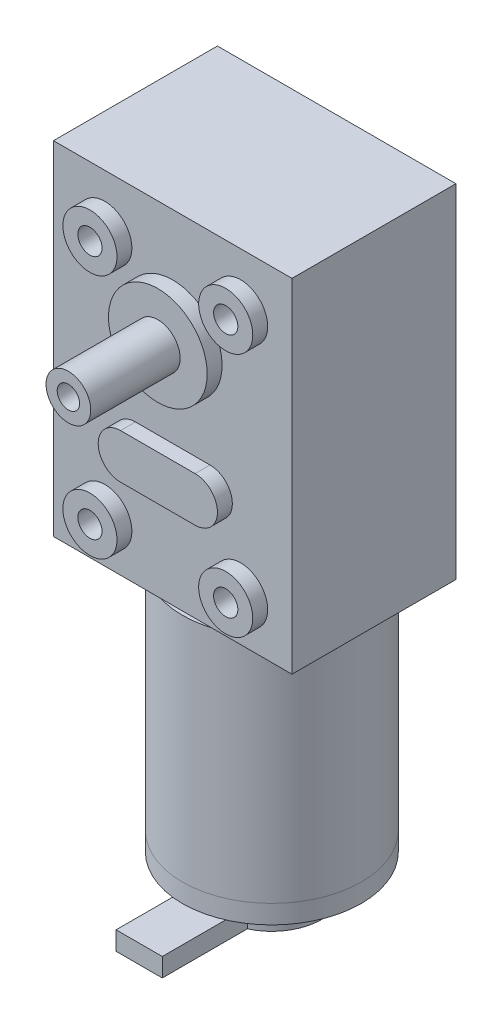
ISO-10303-21;
HEADER;
FILE_DESCRIPTION(('STEP AP214'),'2;1');
FILE_NAME('part.step','',(''),(''),'','','');
FILE_SCHEMA(('AUTOMOTIVE_DESIGN { 1 0 10303 214 1 1 1 1 }'));
ENDSEC;
DATA;
#1=APPLICATION_CONTEXT('core data for automotive mechanical design processes');
#2=APPLICATION_PROTOCOL_DEFINITION('international standard','automotive_design',2000,#1);
#3=PRODUCT_CONTEXT('',#1,'mechanical');
#4=PRODUCT('Part','Part','',(#3));
#5=PRODUCT_RELATED_PRODUCT_CATEGORY('part','',(#4));
#6=PRODUCT_DEFINITION_FORMATION('','',#4);
#7=PRODUCT_DEFINITION_CONTEXT('part definition',#1,'design');
#8=PRODUCT_DEFINITION('design','',#6,#7);
#9=PRODUCT_DEFINITION_SHAPE('','',#8);
#10=(LENGTH_UNIT() NAMED_UNIT(*) SI_UNIT(.MILLI.,.METRE.));
#11=(NAMED_UNIT(*) PLANE_ANGLE_UNIT() SI_UNIT($,.RADIAN.));
#12=(NAMED_UNIT(*) SI_UNIT($,.STERADIAN.) SOLID_ANGLE_UNIT());
#13=UNCERTAINTY_MEASURE_WITH_UNIT(LENGTH_MEASURE(1.E-05),#10,'distance_accuracy_value','');
#14=(GEOMETRIC_REPRESENTATION_CONTEXT(3) GLOBAL_UNCERTAINTY_ASSIGNED_CONTEXT((#13)) GLOBAL_UNIT_ASSIGNED_CONTEXT((#10,
#11,#12)) REPRESENTATION_CONTEXT('',''));
#15=CARTESIAN_POINT('',(0.,0.,0.));
#16=DIRECTION('',(0.,0.,1.));
#17=DIRECTION('',(1.,0.,0.));
#18=AXIS2_PLACEMENT_3D('',#15,#16,#17);
#19=CARTESIAN_POINT('',(0.,-61.,-6.));
#20=DIRECTION('',(0.,-1.,0.));
#21=DIRECTION('',(0.,0.,-1.));
#22=AXIS2_PLACEMENT_3D('',#19,#20,#21);
#23=PLANE('',#22);
#24=DIRECTION('',(0.,0.,1.));
#25=VECTOR('',#24,1.);
#26=CARTESIAN_POINT('',(4.6,-61.,-6.));
#27=LINE('',#26,#25);
#28=CARTESIAN_POINT('',(4.6,-61.,-6.));
#29=VERTEX_POINT('',#28);
#30=CARTESIAN_POINT('',(4.6,-61.,6.));
#31=VERTEX_POINT('',#30);
#32=EDGE_CURVE('E287',#29,#31,#27,.T.);
#33=ORIENTED_EDGE('',*,*,#32,.T.);
#34=DIRECTION('',(1.,0.,0.));
#35=VECTOR('',#34,1.);
#36=CARTESIAN_POINT('',(0.,-61.,6.));
#37=LINE('',#36,#35);
#38=CARTESIAN_POINT('',(-1.6,-61.,6.));
#39=VERTEX_POINT('',#38);
#40=EDGE_CURVE('E324',#39,#31,#37,.T.);
#41=ORIENTED_EDGE('',*,*,#40,.F.);
#42=DIRECTION('',(0.,0.,1.));
#43=VECTOR('',#42,1.);
#44=CARTESIAN_POINT('',(-1.6,-61.,-6.));
#45=LINE('',#44,#43);
#46=CARTESIAN_POINT('',(-1.6,-61.,-6.));
#47=VERTEX_POINT('',#46);
#48=EDGE_CURVE('E13',#47,#39,#45,.T.);
#49=ORIENTED_EDGE('',*,*,#48,.F.);
#50=DIRECTION('',(1.,0.,0.));
#51=VECTOR('',#50,1.);
#52=CARTESIAN_POINT('',(0.,-61.,-6.));
#53=LINE('',#52,#51);
#54=EDGE_CURVE('E326',#47,#29,#53,.T.);
#55=ORIENTED_EDGE('',*,*,#54,.T.);
#56=EDGE_LOOP('',(#33,#41,#49,#55));
#57=FACE_BOUND('',#56,.T.);
#58=ADVANCED_FACE('F284',(#57),#23,.T.);
#59=CARTESIAN_POINT('',(-1.6,0.,-6.));
#60=DIRECTION('',(1.,0.,0.));
#61=DIRECTION('',(0.,0.,-1.));
#62=AXIS2_PLACEMENT_3D('',#59,#60,#61);
#63=PLANE('',#62);
#64=ORIENTED_EDGE('',*,*,#48,.T.);
#65=DIRECTION('',(0.,1.,0.));
#66=VECTOR('',#65,1.);
#67=CARTESIAN_POINT('',(-1.6,0.,6.));
#68=LINE('',#67,#66);
#69=CARTESIAN_POINT('',(-1.6,-58.5,6.));
#70=VERTEX_POINT('',#69);
#71=EDGE_CURVE('E342',#39,#70,#68,.T.);
#72=ORIENTED_EDGE('',*,*,#71,.T.);
#73=DIRECTION('',(0.,0.,1.));
#74=VECTOR('',#73,1.);
#75=CARTESIAN_POINT('',(-1.6,-58.5,-6.));
#76=LINE('',#75,#74);
#77=CARTESIAN_POINT('',(-1.6,-58.5,-6.));
#78=VERTEX_POINT('',#77);
#79=EDGE_CURVE('E292',#78,#70,#76,.T.);
#80=ORIENTED_EDGE('',*,*,#79,.F.);
#81=DIRECTION('',(0.,1.,0.));
#82=VECTOR('',#81,1.);
#83=CARTESIAN_POINT('',(-1.6,0.,-6.));
#84=LINE('',#83,#82);
#85=EDGE_CURVE('E305',#47,#78,#84,.T.);
#86=ORIENTED_EDGE('',*,*,#85,.F.);
#87=EDGE_LOOP('',(#64,#72,#80,#86));
#88=FACE_BOUND('',#87,.T.);
#89=ADVANCED_FACE('F357',(#88),#63,.F.);
#90=CARTESIAN_POINT('',(0.,-58.5,-6.));
#91=DIRECTION('',(0.,-1.,0.));
#92=DIRECTION('',(0.,0.,-1.));
#93=AXIS2_PLACEMENT_3D('',#90,#91,#92);
#94=PLANE('',#93);
#95=ORIENTED_EDGE('',*,*,#79,.T.);
#96=DIRECTION('',(1.,0.,0.));
#97=VECTOR('',#96,1.);
#98=CARTESIAN_POINT('',(0.,-58.5,6.));
#99=LINE('',#98,#97);
#100=CARTESIAN_POINT('',(4.6,-58.5,6.));
#101=VERTEX_POINT('',#100);
#102=EDGE_CURVE('E338',#70,#101,#99,.T.);
#103=ORIENTED_EDGE('',*,*,#102,.T.);
#104=DIRECTION('',(0.,0.,1.));
#105=VECTOR('',#104,1.);
#106=CARTESIAN_POINT('',(4.6,-58.5,-6.));
#107=LINE('',#106,#105);
#108=CARTESIAN_POINT('',(4.6,-58.5,-6.));
#109=VERTEX_POINT('',#108);
#110=EDGE_CURVE('E330',#109,#101,#107,.T.);
#111=ORIENTED_EDGE('',*,*,#110,.F.);
#112=DIRECTION('',(1.,0.,0.));
#113=VECTOR('',#112,1.);
#114=CARTESIAN_POINT('',(0.,-58.5,-6.));
#115=LINE('',#114,#113);
#116=EDGE_CURVE('E350',#78,#109,#115,.T.);
#117=ORIENTED_EDGE('',*,*,#116,.F.);
#118=EDGE_LOOP('',(#95,#103,#111,#117));
#119=FACE_BOUND('',#118,.T.);
#120=ADVANCED_FACE('F355',(#119),#94,.F.);
#121=CARTESIAN_POINT('',(4.6,0.,-6.));
#122=DIRECTION('',(1.,0.,0.));
#123=DIRECTION('',(0.,0.,-1.));
#124=AXIS2_PLACEMENT_3D('',#121,#122,#123);
#125=PLANE('',#124);
#126=ORIENTED_EDGE('',*,*,#110,.T.);
#127=DIRECTION('',(0.,1.,0.));
#128=VECTOR('',#127,1.);
#129=CARTESIAN_POINT('',(4.6,0.,6.));
#130=LINE('',#129,#128);
#131=EDGE_CURVE('E332',#31,#101,#130,.T.);
#132=ORIENTED_EDGE('',*,*,#131,.F.);
#133=ORIENTED_EDGE('',*,*,#32,.F.);
#134=DIRECTION('',(0.,1.,0.));
#135=VECTOR('',#134,1.);
#136=CARTESIAN_POINT('',(4.6,0.,-6.));
#137=LINE('',#136,#135);
#138=EDGE_CURVE('E348',#29,#109,#137,.T.);
#139=ORIENTED_EDGE('',*,*,#138,.T.);
#140=EDGE_LOOP('',(#126,#132,#133,#139));
#141=FACE_BOUND('',#140,.T.);
#142=ADVANCED_FACE('F333',(#141),#125,.T.);
#143=CARTESIAN_POINT('',(0.,0.,-6.));
#144=DIRECTION('',(0.,0.,1.));
#145=DIRECTION('',(1.,0.,0.));
#146=AXIS2_PLACEMENT_3D('',#143,#144,#145);
#147=PLANE('',#146);
#148=ORIENTED_EDGE('',*,*,#54,.F.);
#149=ORIENTED_EDGE('',*,*,#85,.T.);
#150=ORIENTED_EDGE('',*,*,#116,.T.);
#151=ORIENTED_EDGE('',*,*,#138,.F.);
#152=EDGE_LOOP('',(#148,#149,#150,#151));
#153=FACE_BOUND('',#152,.T.);
#154=ADVANCED_FACE('F358',(#153),#147,.F.);
#155=CARTESIAN_POINT('',(0.,0.,6.));
#156=DIRECTION('',(0.,0.,1.));
#157=DIRECTION('',(1.,0.,0.));
#158=AXIS2_PLACEMENT_3D('',#155,#156,#157);
#159=PLANE('',#158);
#160=ORIENTED_EDGE('',*,*,#40,.T.);
#161=ORIENTED_EDGE('',*,*,#131,.T.);
#162=ORIENTED_EDGE('',*,*,#102,.F.);
#163=ORIENTED_EDGE('',*,*,#71,.F.);
#164=EDGE_LOOP('',(#160,#161,#162,#163));
#165=FACE_BOUND('',#164,.T.);
#166=ADVANCED_FACE('F340',(#165),#159,.T.);
#167=CLOSED_SHELL('',(#58,#89,#120,#142,#154,#166));
#168=MANIFOLD_SOLID_BREP('B2',#167);
#169=CARTESIAN_POINT('',(1.8,-61.,-11.5));
#170=DIRECTION('',(0.,1.,0.));
#171=DIRECTION('',(0.,0.,1.));
#172=AXIS2_PLACEMENT_3D('',#169,#170,#171);
#173=CYLINDRICAL_SURFACE('',#172,6.7);
#174=CARTESIAN_POINT('',(1.8,-58.5,-11.5));
#175=DIRECTION('',(0.,-1.,0.));
#176=DIRECTION('',(0.,0.,-1.));
#177=AXIS2_PLACEMENT_3D('',#174,#175,#176);
#178=CIRCLE('',#177,6.7);
#179=CARTESIAN_POINT('',(4.6,-58.5,-5.41312888258672));
#180=VERTEX_POINT('',#179);
#181=CARTESIAN_POINT('',(-1.6,-58.5,-5.72678599045557));
#182=VERTEX_POINT('',#181);
#183=EDGE_CURVE('E282',#180,#182,#178,.T.);
#184=ORIENTED_EDGE('',*,*,#183,.F.);
#185=DIRECTION('',(0.,1.,0.));
#186=VECTOR('',#185,1.);
#187=CARTESIAN_POINT('',(4.6,-61.,-5.41312888258672));
#188=LINE('',#187,#186);
#189=CARTESIAN_POINT('',(4.6,-61.,-5.41312888258672));
#190=VERTEX_POINT('',#189);
#191=EDGE_CURVE('E473',#180,#190,#188,.F.);
#192=ORIENTED_EDGE('',*,*,#191,.T.);
#193=CARTESIAN_POINT('',(1.8,-61.,-11.5));
#194=DIRECTION('',(0.,-1.,0.));
#195=DIRECTION('',(0.,0.,-1.));
#196=AXIS2_PLACEMENT_3D('',#193,#194,#195);
#197=CIRCLE('',#196,6.7);
#198=CARTESIAN_POINT('',(-1.6,-61.,-5.72678599045557));
#199=VERTEX_POINT('',#198);
#200=EDGE_CURVE('E458',#199,#190,#197,.T.);
#201=ORIENTED_EDGE('',*,*,#200,.F.);
#202=DIRECTION('',(0.,1.,0.));
#203=VECTOR('',#202,1.);
#204=CARTESIAN_POINT('',(-1.6,-61.,-5.72678599045557));
#205=LINE('',#204,#203);
#206=EDGE_CURVE('E514',#182,#199,#205,.F.);
#207=ORIENTED_EDGE('',*,*,#206,.F.);
#208=EDGE_LOOP('',(#184,#192,#201,#207));
#209=FACE_BOUND('',#208,.T.);
#210=CARTESIAN_POINT('',(1.8,-56.5,-11.5));
#211=DIRECTION('',(0.,-1.,0.));
#212=DIRECTION('',(0.,0.,-1.));
#213=AXIS2_PLACEMENT_3D('',#210,#211,#212);
#214=CIRCLE('',#213,6.7);
#215=CARTESIAN_POINT('',(1.8,-56.5,-18.2));
#216=VERTEX_POINT('',#215);
#217=EDGE_CURVE('E520',#216,#216,#214,.T.);
#218=ORIENTED_EDGE('',*,*,#217,.T.);
#219=EDGE_LOOP('',(#218));
#220=FACE_BOUND('',#219,.T.);
#221=ADVANCED_FACE('F451',(#209,#220),#173,.T.);
#222=CARTESIAN_POINT('',(1.8,-61.,-11.5));
#223=DIRECTION('',(0.,-1.,0.));
#224=DIRECTION('',(0.,0.,-1.));
#225=AXIS2_PLACEMENT_3D('',#222,#223,#224);
#226=PLANE('',#225);
#227=DIRECTION('',(0.,0.,1.));
#228=VECTOR('',#227,1.);
#229=CARTESIAN_POINT('',(4.6,-61.,-6.));
#230=LINE('',#229,#228);
#231=CARTESIAN_POINT('',(4.6,-61.,-6.));
#232=VERTEX_POINT('',#231);
#233=EDGE_CURVE('E515',#232,#190,#230,.T.);
#234=ORIENTED_EDGE('',*,*,#233,.F.);
#235=DIRECTION('',(1.,0.,0.));
#236=VECTOR('',#235,1.);
#237=CARTESIAN_POINT('',(0.,-61.,-6.));
#238=LINE('',#237,#236);
#239=CARTESIAN_POINT('',(-1.6,-61.,-6.));
#240=VERTEX_POINT('',#239);
#241=EDGE_CURVE('E497',#240,#232,#238,.T.);
#242=ORIENTED_EDGE('',*,*,#241,.F.);
#243=DIRECTION('',(0.,0.,1.));
#244=VECTOR('',#243,1.);
#245=CARTESIAN_POINT('',(-1.6,-61.,-6.));
#246=LINE('',#245,#244);
#247=EDGE_CURVE('E495',#240,#199,#246,.T.);
#248=ORIENTED_EDGE('',*,*,#247,.T.);
#249=ORIENTED_EDGE('',*,*,#200,.T.);
#250=EDGE_LOOP('',(#234,#242,#248,#249));
#251=FACE_BOUND('',#250,.T.);
#252=ADVANCED_FACE('F528',(#251),#226,.T.);
#253=CARTESIAN_POINT('',(1.8,-56.5,-11.5));
#254=DIRECTION('',(0.,-1.,0.));
#255=DIRECTION('',(0.,0.,-1.));
#256=AXIS2_PLACEMENT_3D('',#253,#254,#255);
#257=PLANE('',#256);
#258=ORIENTED_EDGE('',*,*,#217,.F.);
#259=EDGE_LOOP('',(#258));
#260=FACE_BOUND('',#259,.T.);
#261=ADVANCED_FACE('F526',(#260),#257,.F.);
#262=CARTESIAN_POINT('',(0.,-58.5,-6.));
#263=DIRECTION('',(0.,-1.,0.));
#264=DIRECTION('',(0.,0.,-1.));
#265=AXIS2_PLACEMENT_3D('',#262,#263,#264);
#266=PLANE('',#265);
#267=ORIENTED_EDGE('',*,*,#183,.T.);
#268=DIRECTION('',(0.,0.,1.));
#269=VECTOR('',#268,1.);
#270=CARTESIAN_POINT('',(-1.6,-58.5,-6.));
#271=LINE('',#270,#269);
#272=CARTESIAN_POINT('',(-1.6,-58.5,-6.));
#273=VERTEX_POINT('',#272);
#274=EDGE_CURVE('E492',#273,#182,#271,.T.);
#275=ORIENTED_EDGE('',*,*,#274,.F.);
#276=DIRECTION('',(1.,0.,0.));
#277=VECTOR('',#276,1.);
#278=CARTESIAN_POINT('',(0.,-58.5,-6.));
#279=LINE('',#278,#277);
#280=CARTESIAN_POINT('',(4.6,-58.5,-6.));
#281=VERTEX_POINT('',#280);
#282=EDGE_CURVE('E498',#273,#281,#279,.T.);
#283=ORIENTED_EDGE('',*,*,#282,.T.);
#284=DIRECTION('',(0.,0.,1.));
#285=VECTOR('',#284,1.);
#286=CARTESIAN_POINT('',(4.6,-58.5,-6.));
#287=LINE('',#286,#285);
#288=EDGE_CURVE('E512',#281,#180,#287,.T.);
#289=ORIENTED_EDGE('',*,*,#288,.T.);
#290=EDGE_LOOP('',(#267,#275,#283,#289));
#291=FACE_BOUND('',#290,.T.);
#292=ADVANCED_FACE('F501',(#291),#266,.T.);
#293=CARTESIAN_POINT('',(4.6,0.,-6.));
#294=DIRECTION('',(1.,0.,0.));
#295=DIRECTION('',(0.,0.,-1.));
#296=AXIS2_PLACEMENT_3D('',#293,#294,#295);
#297=PLANE('',#296);
#298=ORIENTED_EDGE('',*,*,#288,.F.);
#299=DIRECTION('',(0.,1.,0.));
#300=VECTOR('',#299,1.);
#301=CARTESIAN_POINT('',(4.6,0.,-6.));
#302=LINE('',#301,#300);
#303=EDGE_CURVE('E503',#232,#281,#302,.T.);
#304=ORIENTED_EDGE('',*,*,#303,.F.);
#305=ORIENTED_EDGE('',*,*,#233,.T.);
#306=ORIENTED_EDGE('',*,*,#191,.F.);
#307=EDGE_LOOP('',(#298,#304,#305,#306));
#308=FACE_BOUND('',#307,.T.);
#309=ADVANCED_FACE('F533',(#308),#297,.F.);
#310=CARTESIAN_POINT('',(-1.6,0.,-6.));
#311=DIRECTION('',(1.,0.,0.));
#312=DIRECTION('',(0.,0.,-1.));
#313=AXIS2_PLACEMENT_3D('',#310,#311,#312);
#314=PLANE('',#313);
#315=ORIENTED_EDGE('',*,*,#206,.T.);
#316=ORIENTED_EDGE('',*,*,#247,.F.);
#317=DIRECTION('',(0.,1.,0.));
#318=VECTOR('',#317,1.);
#319=CARTESIAN_POINT('',(-1.6,0.,-6.));
#320=LINE('',#319,#318);
#321=EDGE_CURVE('E465',#240,#273,#320,.T.);
#322=ORIENTED_EDGE('',*,*,#321,.T.);
#323=ORIENTED_EDGE('',*,*,#274,.T.);
#324=EDGE_LOOP('',(#315,#316,#322,#323));
#325=FACE_BOUND('',#324,.T.);
#326=ADVANCED_FACE('F491',(#325),#314,.T.);
#327=CARTESIAN_POINT('',(0.,0.,-6.));
#328=DIRECTION('',(0.,0.,1.));
#329=DIRECTION('',(1.,0.,0.));
#330=AXIS2_PLACEMENT_3D('',#327,#328,#329);
#331=PLANE('',#330);
#332=ORIENTED_EDGE('',*,*,#282,.F.);
#333=ORIENTED_EDGE('',*,*,#321,.F.);
#334=ORIENTED_EDGE('',*,*,#241,.T.);
#335=ORIENTED_EDGE('',*,*,#303,.T.);
#336=EDGE_LOOP('',(#332,#333,#334,#335));
#337=FACE_BOUND('',#336,.T.);
#338=ADVANCED_FACE('F506',(#337),#331,.T.);
#339=CLOSED_SHELL('',(#221,#252,#261,#292,#309,#326,#338));
#340=MANIFOLD_SOLID_BREP('B7',#339);
#341=CARTESIAN_POINT('',(1.8,-56.5,-11.5));
#342=DIRECTION('',(0.,1.,0.));
#343=DIRECTION('',(0.,0.,1.));
#344=AXIS2_PLACEMENT_3D('',#341,#342,#343);
#345=CYLINDRICAL_SURFACE('',#344,12.);
#346=CARTESIAN_POINT('',(1.8,-56.5,-11.5));
#347=DIRECTION('',(0.,-1.,0.));
#348=DIRECTION('',(0.,0.,-1.));
#349=AXIS2_PLACEMENT_3D('',#346,#347,#348);
#350=CIRCLE('',#349,12.);
#351=CARTESIAN_POINT('',(1.8,-56.5,-23.5));
#352=VERTEX_POINT('',#351);
#353=EDGE_CURVE('E450',#352,#352,#350,.T.);
#354=ORIENTED_EDGE('',*,*,#353,.F.);
#355=EDGE_LOOP('',(#354));
#356=FACE_BOUND('',#355,.T.);
#357=CARTESIAN_POINT('',(1.8,-54.,-11.5));
#358=DIRECTION('',(0.,-1.,0.));
#359=DIRECTION('',(0.,0.,-1.));
#360=AXIS2_PLACEMENT_3D('',#357,#358,#359);
#361=CIRCLE('',#360,12.);
#362=CARTESIAN_POINT('',(1.8,-54.,-23.5));
#363=VERTEX_POINT('',#362);
#364=EDGE_CURVE('E626',#363,#363,#361,.T.);
#365=ORIENTED_EDGE('',*,*,#364,.T.);
#366=EDGE_LOOP('',(#365));
#367=FACE_BOUND('',#366,.T.);
#368=ADVANCED_FACE('F623',(#356,#367),#345,.T.);
#369=CARTESIAN_POINT('',(1.8,-56.5,-11.5));
#370=DIRECTION('',(0.,-1.,0.));
#371=DIRECTION('',(0.,0.,-1.));
#372=AXIS2_PLACEMENT_3D('',#369,#370,#371);
#373=PLANE('',#372);
#374=ORIENTED_EDGE('',*,*,#353,.T.);
#375=EDGE_LOOP('',(#374));
#376=FACE_BOUND('',#375,.T.);
#377=ADVANCED_FACE('F638',(#376),#373,.T.);
#378=CARTESIAN_POINT('',(1.8,-54.,-11.5));
#379=DIRECTION('',(0.,-1.,0.));
#380=DIRECTION('',(0.,0.,-1.));
#381=AXIS2_PLACEMENT_3D('',#378,#379,#380);
#382=PLANE('',#381);
#383=ORIENTED_EDGE('',*,*,#364,.F.);
#384=EDGE_LOOP('',(#383));
#385=FACE_BOUND('',#384,.T.);
#386=ADVANCED_FACE('F636',(#385),#382,.F.);
#387=CLOSED_SHELL('',(#368,#377,#386));
#388=MANIFOLD_SOLID_BREP('B276',#387);
#389=CARTESIAN_POINT('',(1.8,-54.,-11.5));
#390=DIRECTION('',(0.,1.,0.));
#391=DIRECTION('',(0.,0.,1.));
#392=AXIS2_PLACEMENT_3D('',#389,#390,#391);
#393=CYLINDRICAL_SURFACE('',#392,12.);
#394=CARTESIAN_POINT('',(1.8,-54.,-11.5));
#395=DIRECTION('',(0.,-1.,0.));
#396=DIRECTION('',(0.,0.,-1.));
#397=AXIS2_PLACEMENT_3D('',#394,#395,#396);
#398=CIRCLE('',#397,12.);
#399=CARTESIAN_POINT('',(1.8,-54.,-23.5));
#400=VERTEX_POINT('',#399);
#401=EDGE_CURVE('E622',#400,#400,#398,.T.);
#402=ORIENTED_EDGE('',*,*,#401,.F.);
#403=EDGE_LOOP('',(#402));
#404=FACE_BOUND('',#403,.T.);
#405=CARTESIAN_POINT('',(1.8,-23.,-11.5));
#406=DIRECTION('',(0.,-1.,0.));
#407=DIRECTION('',(0.,0.,-1.));
#408=AXIS2_PLACEMENT_3D('',#405,#406,#407);
#409=CIRCLE('',#408,12.);
#410=CARTESIAN_POINT('',(1.8,-23.,-23.5));
#411=VERTEX_POINT('',#410);
#412=EDGE_CURVE('E681',#411,#411,#409,.T.);
#413=ORIENTED_EDGE('',*,*,#412,.T.);
#414=EDGE_LOOP('',(#413));
#415=FACE_BOUND('',#414,.T.);
#416=ADVANCED_FACE('F678',(#404,#415),#393,.T.);
#417=CARTESIAN_POINT('',(1.8,-54.,-11.5));
#418=DIRECTION('',(0.,-1.,0.));
#419=DIRECTION('',(0.,0.,-1.));
#420=AXIS2_PLACEMENT_3D('',#417,#418,#419);
#421=PLANE('',#420);
#422=ORIENTED_EDGE('',*,*,#401,.T.);
#423=EDGE_LOOP('',(#422));
#424=FACE_BOUND('',#423,.T.);
#425=ADVANCED_FACE('F693',(#424),#421,.T.);
#426=CARTESIAN_POINT('',(1.8,-23.,-11.5));
#427=DIRECTION('',(0.,-1.,0.));
#428=DIRECTION('',(0.,0.,-1.));
#429=AXIS2_PLACEMENT_3D('',#426,#427,#428);
#430=PLANE('',#429);
#431=ORIENTED_EDGE('',*,*,#412,.F.);
#432=EDGE_LOOP('',(#431));
#433=FACE_BOUND('',#432,.T.);
#434=ADVANCED_FACE('F691',(#433),#430,.F.);
#435=CLOSED_SHELL('',(#416,#425,#434));
#436=MANIFOLD_SOLID_BREP('B445',#435);
#437=CARTESIAN_POINT('',(9.11,15.77,-12.));
#438=DIRECTION('',(0.,0.,1.));
#439=DIRECTION('',(1.,0.,0.));
#440=AXIS2_PLACEMENT_3D('',#437,#438,#439);
#441=CYLINDRICAL_SURFACE('',#440,1.625);
#442=CARTESIAN_POINT('',(9.11,15.77,-12.));
#443=DIRECTION('',(0.,0.,1.));
#444=DIRECTION('',(1.,0.,0.));
#445=AXIS2_PLACEMENT_3D('',#442,#443,#444);
#446=CIRCLE('',#445,1.625);
#447=CARTESIAN_POINT('',(10.735,15.77,-12.));
#448=VERTEX_POINT('',#447);
#449=EDGE_CURVE('E925',#448,#448,#446,.T.);
#450=ORIENTED_EDGE('',*,*,#449,.F.);
#451=EDGE_LOOP('',(#450));
#452=FACE_BOUND('',#451,.T.);
#453=CARTESIAN_POINT('',(9.11,15.77,2.));
#454=DIRECTION('',(0.,0.,1.));
#455=DIRECTION('',(1.,0.,0.));
#456=AXIS2_PLACEMENT_3D('',#453,#454,#455);
#457=CIRCLE('',#456,1.625);
#458=CARTESIAN_POINT('',(10.735,15.77,2.));
#459=VERTEX_POINT('',#458);
#460=EDGE_CURVE('E929',#459,#459,#457,.F.);
#461=ORIENTED_EDGE('',*,*,#460,.F.);
#462=EDGE_LOOP('',(#461));
#463=FACE_BOUND('',#462,.T.);
#464=ADVANCED_FACE('F743',(#452,#463),#441,.F.);
#465=CARTESIAN_POINT('',(9.11,15.77,-12.));
#466=DIRECTION('',(0.,0.,1.));
#467=DIRECTION('',(1.,0.,0.));
#468=AXIS2_PLACEMENT_3D('',#465,#466,#467);
#469=PLANE('',#468);
#470=ORIENTED_EDGE('',*,*,#449,.T.);
#471=EDGE_LOOP('',(#470));
#472=FACE_BOUND('',#471,.T.);
#473=ADVANCED_FACE('F944',(#472),#469,.T.);
#474=CARTESIAN_POINT('',(0.,0.,0.));
#475=DIRECTION('',(0.,0.,1.));
#476=DIRECTION('',(1.,0.,0.));
#477=AXIS2_PLACEMENT_3D('',#474,#475,#476);
#478=PLANE('',#477);
#479=CARTESIAN_POINT('',(0.,8.2,0.));
#480=DIRECTION('',(0.,0.,1.));
#481=DIRECTION('',(1.,0.,0.));
#482=AXIS2_PLACEMENT_3D('',#479,#480,#481);
#483=CIRCLE('',#482,6.62);
#484=CARTESIAN_POINT('',(6.62,8.2,0.));
#485=VERTEX_POINT('',#484);
#486=EDGE_CURVE('E913',#485,#485,#483,.T.);
#487=ORIENTED_EDGE('',*,*,#486,.F.);
#488=EDGE_LOOP('',(#487));
#489=FACE_BOUND('',#488,.T.);
#490=CARTESIAN_POINT('',(-9.11000000000001,-17.13,0.));
#491=DIRECTION('',(0.,0.,1.));
#492=DIRECTION('',(1.,0.,0.));
#493=AXIS2_PLACEMENT_3D('',#490,#491,#492);
#494=CIRCLE('',#493,3.63);
#495=CARTESIAN_POINT('',(-5.48000000000001,-17.13,0.));
#496=VERTEX_POINT('',#495);
#497=EDGE_CURVE('E844',#496,#496,#494,.F.);
#498=ORIENTED_EDGE('',*,*,#497,.T.);
#499=EDGE_LOOP('',(#498));
#500=FACE_BOUND('',#499,.T.);
#501=CARTESIAN_POINT('',(9.11,-17.13,0.));
#502=DIRECTION('',(0.,0.,1.));
#503=DIRECTION('',(1.,0.,0.));
#504=AXIS2_PLACEMENT_3D('',#501,#502,#503);
#505=CIRCLE('',#504,3.63);
#506=CARTESIAN_POINT('',(12.74,-17.13,0.));
#507=VERTEX_POINT('',#506);
#508=EDGE_CURVE('E676',#507,#507,#505,.T.);
#509=ORIENTED_EDGE('',*,*,#508,.F.);
#510=EDGE_LOOP('',(#509));
#511=FACE_BOUND('',#510,.T.);
#512=CARTESIAN_POINT('',(-9.11,15.77,0.));
#513=DIRECTION('',(0.,0.,1.));
#514=DIRECTION('',(1.,0.,0.));
#515=AXIS2_PLACEMENT_3D('',#512,#513,#514);
#516=CIRCLE('',#515,3.63);
#517=CARTESIAN_POINT('',(-5.48,15.77,0.));
#518=VERTEX_POINT('',#517);
#519=EDGE_CURVE('E862',#518,#518,#516,.F.);
#520=ORIENTED_EDGE('',*,*,#519,.T.);
#521=EDGE_LOOP('',(#520));
#522=FACE_BOUND('',#521,.T.);
#523=CARTESIAN_POINT('',(9.11,15.77,0.));
#524=DIRECTION('',(0.,0.,1.));
#525=DIRECTION('',(1.,0.,0.));
#526=AXIS2_PLACEMENT_3D('',#523,#524,#525);
#527=CIRCLE('',#526,3.63);
#528=CARTESIAN_POINT('',(12.74,15.77,0.));
#529=VERTEX_POINT('',#528);
#530=EDGE_CURVE('E747',#529,#529,#527,.T.);
#531=ORIENTED_EDGE('',*,*,#530,.F.);
#532=EDGE_LOOP('',(#531));
#533=FACE_BOUND('',#532,.T.);
#534=DIRECTION('',(1.,0.,0.));
#535=VECTOR('',#534,1.);
#536=CARTESIAN_POINT('',(0.,-10.1875,0.));
#537=LINE('',#536,#535);
#538=CARTESIAN_POINT('',(-5.,-10.1875,0.));
#539=VERTEX_POINT('',#538);
#540=CARTESIAN_POINT('',(5.,-10.1875,0.));
#541=VERTEX_POINT('',#540);
#542=EDGE_CURVE('E886',#539,#541,#537,.T.);
#543=ORIENTED_EDGE('',*,*,#542,.F.);
#544=CARTESIAN_POINT('',(-5.,-7.18749999999999,0.));
#545=DIRECTION('',(0.,0.,1.));
#546=DIRECTION('',(1.,0.,0.));
#547=AXIS2_PLACEMENT_3D('',#544,#545,#546);
#548=CIRCLE('',#547,3.);
#549=CARTESIAN_POINT('',(-5.,-4.1875,0.));
#550=VERTEX_POINT('',#549);
#551=EDGE_CURVE('E764',#550,#539,#548,.T.);
#552=ORIENTED_EDGE('',*,*,#551,.F.);
#553=DIRECTION('',(1.,0.,0.));
#554=VECTOR('',#553,1.);
#555=CARTESIAN_POINT('',(0.,-4.1875,0.));
#556=LINE('',#555,#554);
#557=CARTESIAN_POINT('',(5.,-4.1875,0.));
#558=VERTEX_POINT('',#557);
#559=EDGE_CURVE('E759',#550,#558,#556,.T.);
#560=ORIENTED_EDGE('',*,*,#559,.T.);
#561=CARTESIAN_POINT('',(5.,-7.18749999999999,0.));
#562=DIRECTION('',(0.,0.,1.));
#563=DIRECTION('',(1.,0.,0.));
#564=AXIS2_PLACEMENT_3D('',#561,#562,#563);
#565=CIRCLE('',#564,3.);
#566=EDGE_CURVE('E897',#541,#558,#565,.T.);
#567=ORIENTED_EDGE('',*,*,#566,.F.);
#568=EDGE_LOOP('',(#543,#552,#560,#567));
#569=FACE_BOUND('',#568,.T.);
#570=DIRECTION('',(1.,0.,0.));
#571=VECTOR('',#570,1.);
#572=CARTESIAN_POINT('',(-16.,23.,0.));
#573=LINE('',#572,#571);
#574=CARTESIAN_POINT('',(-16.,23.,0.));
#575=VERTEX_POINT('',#574);
#576=CARTESIAN_POINT('',(16.,23.,0.));
#577=VERTEX_POINT('',#576);
#578=EDGE_CURVE('E865',#575,#577,#573,.T.);
#579=ORIENTED_EDGE('',*,*,#578,.F.);
#580=DIRECTION('',(0.,1.,0.));
#581=VECTOR('',#580,1.);
#582=CARTESIAN_POINT('',(-16.,-23.,0.));
#583=LINE('',#582,#581);
#584=CARTESIAN_POINT('',(-16.,-23.,0.));
#585=VERTEX_POINT('',#584);
#586=EDGE_CURVE('E872',#585,#575,#583,.T.);
#587=ORIENTED_EDGE('',*,*,#586,.F.);
#588=DIRECTION('',(1.,0.,0.));
#589=VECTOR('',#588,1.);
#590=CARTESIAN_POINT('',(-16.,-23.,0.));
#591=LINE('',#590,#589);
#592=CARTESIAN_POINT('',(16.,-23.,0.));
#593=VERTEX_POINT('',#592);
#594=EDGE_CURVE('E880',#585,#593,#591,.T.);
#595=ORIENTED_EDGE('',*,*,#594,.T.);
#596=DIRECTION('',(0.,1.,0.));
#597=VECTOR('',#596,1.);
#598=CARTESIAN_POINT('',(16.,-23.,0.));
#599=LINE('',#598,#597);
#600=EDGE_CURVE('E883',#593,#577,#599,.T.);
#601=ORIENTED_EDGE('',*,*,#600,.T.);
#602=EDGE_LOOP('',(#579,#587,#595,#601));
#603=FACE_BOUND('',#602,.T.);
#604=ADVANCED_FACE('F950',(#489,#500,#511,#522,#533,#569,#603),#478,.T.);
#605=CARTESIAN_POINT('',(0.,0.,-22.));
#606=DIRECTION('',(0.,0.,1.));
#607=DIRECTION('',(1.,0.,0.));
#608=AXIS2_PLACEMENT_3D('',#605,#606,#607);
#609=PLANE('',#608);
#610=DIRECTION('',(1.,0.,0.));
#611=VECTOR('',#610,1.);
#612=CARTESIAN_POINT('',(-16.,23.,-22.));
#613=LINE('',#612,#611);
#614=CARTESIAN_POINT('',(-16.,23.,-22.));
#615=VERTEX_POINT('',#614);
#616=CARTESIAN_POINT('',(16.,23.,-22.));
#617=VERTEX_POINT('',#616);
#618=EDGE_CURVE('E875',#615,#617,#613,.T.);
#619=ORIENTED_EDGE('',*,*,#618,.T.);
#620=DIRECTION('',(0.,1.,0.));
#621=VECTOR('',#620,1.);
#622=CARTESIAN_POINT('',(16.,-23.,-22.));
#623=LINE('',#622,#621);
#624=CARTESIAN_POINT('',(16.,-23.,-22.));
#625=VERTEX_POINT('',#624);
#626=EDGE_CURVE('E869',#625,#617,#623,.T.);
#627=ORIENTED_EDGE('',*,*,#626,.F.);
#628=DIRECTION('',(1.,0.,0.));
#629=VECTOR('',#628,1.);
#630=CARTESIAN_POINT('',(-16.,-23.,-22.));
#631=LINE('',#630,#629);
#632=CARTESIAN_POINT('',(-16.,-23.,-22.));
#633=VERTEX_POINT('',#632);
#634=EDGE_CURVE('E868',#633,#625,#631,.T.);
#635=ORIENTED_EDGE('',*,*,#634,.F.);
#636=DIRECTION('',(0.,1.,0.));
#637=VECTOR('',#636,1.);
#638=CARTESIAN_POINT('',(-16.,-23.,-22.));
#639=LINE('',#638,#637);
#640=EDGE_CURVE('E889',#633,#615,#639,.T.);
#641=ORIENTED_EDGE('',*,*,#640,.T.);
#642=EDGE_LOOP('',(#619,#627,#635,#641));
#643=FACE_BOUND('',#642,.T.);
#644=ADVANCED_FACE('F953',(#643),#609,.F.);
#645=CARTESIAN_POINT('',(16.,-23.,-22.));
#646=DIRECTION('',(1.,0.,0.));
#647=DIRECTION('',(0.,0.,-1.));
#648=AXIS2_PLACEMENT_3D('',#645,#646,#647);
#649=PLANE('',#648);
#650=ORIENTED_EDGE('',*,*,#600,.F.);
#651=DIRECTION('',(0.,0.,1.));
#652=VECTOR('',#651,1.);
#653=CARTESIAN_POINT('',(16.,-23.,-22.));
#654=LINE('',#653,#652);
#655=EDGE_CURVE('E870',#625,#593,#654,.T.);
#656=ORIENTED_EDGE('',*,*,#655,.F.);
#657=ORIENTED_EDGE('',*,*,#626,.T.);
#658=DIRECTION('',(0.,0.,1.));
#659=VECTOR('',#658,1.);
#660=CARTESIAN_POINT('',(16.,23.,-22.));
#661=LINE('',#660,#659);
#662=EDGE_CURVE('E866',#617,#577,#661,.T.);
#663=ORIENTED_EDGE('',*,*,#662,.T.);
#664=EDGE_LOOP('',(#650,#656,#657,#663));
#665=FACE_BOUND('',#664,.T.);
#666=ADVANCED_FACE('F1039',(#665),#649,.T.);
#667=CARTESIAN_POINT('',(-16.,-23.,-22.));
#668=DIRECTION('',(0.,-1.,0.));
#669=DIRECTION('',(0.,0.,-1.));
#670=AXIS2_PLACEMENT_3D('',#667,#668,#669);
#671=PLANE('',#670);
#672=ORIENTED_EDGE('',*,*,#594,.F.);
#673=DIRECTION('',(0.,0.,1.));
#674=VECTOR('',#673,1.);
#675=CARTESIAN_POINT('',(-16.,-23.,-22.));
#676=LINE('',#675,#674);
#677=EDGE_CURVE('E873',#633,#585,#676,.T.);
#678=ORIENTED_EDGE('',*,*,#677,.F.);
#679=ORIENTED_EDGE('',*,*,#634,.T.);
#680=ORIENTED_EDGE('',*,*,#655,.T.);
#681=EDGE_LOOP('',(#672,#678,#679,#680));
#682=FACE_BOUND('',#681,.T.);
#683=ADVANCED_FACE('F1048',(#682),#671,.T.);
#684=CARTESIAN_POINT('',(-16.,-23.,-22.));
#685=DIRECTION('',(1.,0.,0.));
#686=DIRECTION('',(0.,0.,-1.));
#687=AXIS2_PLACEMENT_3D('',#684,#685,#686);
#688=PLANE('',#687);
#689=ORIENTED_EDGE('',*,*,#586,.T.);
#690=DIRECTION('',(0.,0.,1.));
#691=VECTOR('',#690,1.);
#692=CARTESIAN_POINT('',(-16.,23.,-22.));
#693=LINE('',#692,#691);
#694=EDGE_CURVE('E876',#615,#575,#693,.T.);
#695=ORIENTED_EDGE('',*,*,#694,.F.);
#696=ORIENTED_EDGE('',*,*,#640,.F.);
#697=ORIENTED_EDGE('',*,*,#677,.T.);
#698=EDGE_LOOP('',(#689,#695,#696,#697));
#699=FACE_BOUND('',#698,.T.);
#700=ADVANCED_FACE('F745',(#699),#688,.F.);
#701=CARTESIAN_POINT('',(-16.,23.,-22.));
#702=DIRECTION('',(0.,-1.,0.));
#703=DIRECTION('',(1.,0.,0.));
#704=AXIS2_PLACEMENT_3D('',#701,#702,#703);
#705=PLANE('',#704);
#706=ORIENTED_EDGE('',*,*,#578,.T.);
#707=ORIENTED_EDGE('',*,*,#662,.F.);
#708=ORIENTED_EDGE('',*,*,#618,.F.);
#709=ORIENTED_EDGE('',*,*,#694,.T.);
#710=EDGE_LOOP('',(#706,#707,#708,#709));
#711=FACE_BOUND('',#710,.T.);
#712=ADVANCED_FACE('F1035',(#711),#705,.F.);
#713=CARTESIAN_POINT('',(-9.11,15.77,-22.));
#714=DIRECTION('',(0.,0.,1.));
#715=DIRECTION('',(1.,0.,0.));
#716=AXIS2_PLACEMENT_3D('',#713,#714,#715);
#717=CYLINDRICAL_SURFACE('',#716,3.63);
#718=ORIENTED_EDGE('',*,*,#519,.F.);
#719=EDGE_LOOP('',(#718));
#720=FACE_BOUND('',#719,.T.);
#721=CARTESIAN_POINT('',(-9.11,15.77,2.));
#722=DIRECTION('',(0.,0.,1.));
#723=DIRECTION('',(1.,0.,0.));
#724=AXIS2_PLACEMENT_3D('',#721,#722,#723);
#725=CIRCLE('',#724,3.63);
#726=CARTESIAN_POINT('',(-5.48,15.77,2.));
#727=VERTEX_POINT('',#726);
#728=EDGE_CURVE('E856',#727,#727,#725,.F.);
#729=ORIENTED_EDGE('',*,*,#728,.T.);
#730=EDGE_LOOP('',(#729));
#731=FACE_BOUND('',#730,.T.);
#732=ADVANCED_FACE('F1031',(#720,#731),#717,.T.);
#733=CARTESIAN_POINT('',(-9.11,15.77,-22.));
#734=DIRECTION('',(0.,0.,1.));
#735=DIRECTION('',(1.,0.,0.));
#736=AXIS2_PLACEMENT_3D('',#733,#734,#735);
#737=CYLINDRICAL_SURFACE('',#736,1.625);
#738=CARTESIAN_POINT('',(-9.11,15.77,2.));
#739=DIRECTION('',(0.,0.,1.));
#740=DIRECTION('',(1.,0.,0.));
#741=AXIS2_PLACEMENT_3D('',#738,#739,#740);
#742=CIRCLE('',#741,1.625);
#743=CARTESIAN_POINT('',(-7.485,15.77,2.));
#744=VERTEX_POINT('',#743);
#745=EDGE_CURVE('E859',#744,#744,#742,.F.);
#746=ORIENTED_EDGE('',*,*,#745,.F.);
#747=EDGE_LOOP('',(#746));
#748=FACE_BOUND('',#747,.T.);
#749=CARTESIAN_POINT('',(-9.11,15.77,-12.));
#750=DIRECTION('',(0.,0.,1.));
#751=DIRECTION('',(1.,0.,0.));
#752=AXIS2_PLACEMENT_3D('',#749,#750,#751);
#753=CIRCLE('',#752,1.625);
#754=CARTESIAN_POINT('',(-7.485,15.77,-12.));
#755=VERTEX_POINT('',#754);
#756=EDGE_CURVE('E917',#755,#755,#753,.F.);
#757=ORIENTED_EDGE('',*,*,#756,.T.);
#758=EDGE_LOOP('',(#757));
#759=FACE_BOUND('',#758,.T.);
#760=ADVANCED_FACE('F1027',(#748,#759),#737,.F.);
#761=CARTESIAN_POINT('',(0.,0.,2.));
#762=DIRECTION('',(0.,0.,1.));
#763=DIRECTION('',(1.,0.,0.));
#764=AXIS2_PLACEMENT_3D('',#761,#762,#763);
#765=PLANE('',#764);
#766=ORIENTED_EDGE('',*,*,#728,.F.);
#767=EDGE_LOOP('',(#766));
#768=FACE_BOUND('',#767,.T.);
#769=ORIENTED_EDGE('',*,*,#745,.T.);
#770=EDGE_LOOP('',(#769));
#771=FACE_BOUND('',#770,.T.);
#772=ADVANCED_FACE('F1024',(#768,#771),#765,.T.);
#773=CARTESIAN_POINT('',(0.,0.,2.));
#774=DIRECTION('',(0.,0.,1.));
#775=DIRECTION('',(1.,0.,0.));
#776=AXIS2_PLACEMENT_3D('',#773,#774,#775);
#777=PLANE('',#776);
#778=ORIENTED_EDGE('',*,*,#460,.T.);
#779=EDGE_LOOP('',(#778));
#780=FACE_BOUND('',#779,.T.);
#781=CARTESIAN_POINT('',(9.11,15.77,2.));
#782=DIRECTION('',(0.,0.,1.));
#783=DIRECTION('',(1.,0.,0.));
#784=AXIS2_PLACEMENT_3D('',#781,#782,#783);
#785=CIRCLE('',#784,3.63);
#786=CARTESIAN_POINT('',(12.74,15.77,2.));
#787=VERTEX_POINT('',#786);
#788=EDGE_CURVE('E852',#787,#787,#785,.T.);
#789=ORIENTED_EDGE('',*,*,#788,.T.);
#790=EDGE_LOOP('',(#789));
#791=FACE_BOUND('',#790,.T.);
#792=ADVANCED_FACE('F940',(#780,#791),#777,.T.);
#793=CARTESIAN_POINT('',(9.11,15.77,-22.));
#794=DIRECTION('',(0.,0.,1.));
#795=DIRECTION('',(1.,0.,0.));
#796=AXIS2_PLACEMENT_3D('',#793,#794,#795);
#797=CYLINDRICAL_SURFACE('',#796,3.63);
#798=ORIENTED_EDGE('',*,*,#530,.T.);
#799=EDGE_LOOP('',(#798));
#800=FACE_BOUND('',#799,.T.);
#801=ORIENTED_EDGE('',*,*,#788,.F.);
#802=EDGE_LOOP('',(#801));
#803=FACE_BOUND('',#802,.T.);
#804=ADVANCED_FACE('F1011',(#800,#803),#797,.T.);
#805=CARTESIAN_POINT('',(9.11,-17.13,-22.));
#806=DIRECTION('',(0.,0.,1.));
#807=DIRECTION('',(1.,0.,0.));
#808=AXIS2_PLACEMENT_3D('',#805,#806,#807);
#809=CYLINDRICAL_SURFACE('',#808,1.625);
#810=CARTESIAN_POINT('',(9.11,-17.13,2.));
#811=DIRECTION('',(0.,0.,1.));
#812=DIRECTION('',(1.,0.,0.));
#813=AXIS2_PLACEMENT_3D('',#810,#811,#812);
#814=CIRCLE('',#813,1.625);
#815=CARTESIAN_POINT('',(10.735,-17.13,2.));
#816=VERTEX_POINT('',#815);
#817=EDGE_CURVE('E850',#816,#816,#814,.T.);
#818=ORIENTED_EDGE('',*,*,#817,.T.);
#819=EDGE_LOOP('',(#818));
#820=FACE_BOUND('',#819,.T.);
#821=CARTESIAN_POINT('',(9.11,-17.13,-12.));
#822=DIRECTION('',(0.,0.,1.));
#823=DIRECTION('',(1.,0.,0.));
#824=AXIS2_PLACEMENT_3D('',#821,#822,#823);
#825=CIRCLE('',#824,1.625);
#826=CARTESIAN_POINT('',(10.735,-17.13,-12.));
#827=VERTEX_POINT('',#826);
#828=EDGE_CURVE('E928',#827,#827,#825,.T.);
#829=ORIENTED_EDGE('',*,*,#828,.F.);
#830=EDGE_LOOP('',(#829));
#831=FACE_BOUND('',#830,.T.);
#832=ADVANCED_FACE('F1007',(#820,#831),#809,.F.);
#833=CARTESIAN_POINT('',(9.11,-17.13,-22.));
#834=DIRECTION('',(0.,0.,1.));
#835=DIRECTION('',(1.,0.,0.));
#836=AXIS2_PLACEMENT_3D('',#833,#834,#835);
#837=CYLINDRICAL_SURFACE('',#836,3.63);
#838=ORIENTED_EDGE('',*,*,#508,.T.);
#839=EDGE_LOOP('',(#838));
#840=FACE_BOUND('',#839,.T.);
#841=CARTESIAN_POINT('',(9.11,-17.13,2.));
#842=DIRECTION('',(0.,0.,1.));
#843=DIRECTION('',(1.,0.,0.));
#844=AXIS2_PLACEMENT_3D('',#841,#842,#843);
#845=CIRCLE('',#844,3.63);
#846=CARTESIAN_POINT('',(12.74,-17.13,2.));
#847=VERTEX_POINT('',#846);
#848=EDGE_CURVE('E847',#847,#847,#845,.T.);
#849=ORIENTED_EDGE('',*,*,#848,.F.);
#850=EDGE_LOOP('',(#849));
#851=FACE_BOUND('',#850,.T.);
#852=ADVANCED_FACE('F1010',(#840,#851),#837,.T.);
#853=CARTESIAN_POINT('',(0.,0.,2.));
#854=DIRECTION('',(0.,0.,1.));
#855=DIRECTION('',(1.,0.,0.));
#856=AXIS2_PLACEMENT_3D('',#853,#854,#855);
#857=PLANE('',#856);
#858=ORIENTED_EDGE('',*,*,#817,.F.);
#859=EDGE_LOOP('',(#858));
#860=FACE_BOUND('',#859,.T.);
#861=ORIENTED_EDGE('',*,*,#848,.T.);
#862=EDGE_LOOP('',(#861));
#863=FACE_BOUND('',#862,.T.);
#864=ADVANCED_FACE('F999',(#860,#863),#857,.T.);
#865=CARTESIAN_POINT('',(-9.11000000000001,-17.13,-22.));
#866=DIRECTION('',(0.,0.,1.));
#867=DIRECTION('',(1.,0.,0.));
#868=AXIS2_PLACEMENT_3D('',#865,#866,#867);
#869=CYLINDRICAL_SURFACE('',#868,3.63);
#870=ORIENTED_EDGE('',*,*,#497,.F.);
#871=EDGE_LOOP('',(#870));
#872=FACE_BOUND('',#871,.T.);
#873=CARTESIAN_POINT('',(-9.11000000000001,-17.13,2.));
#874=DIRECTION('',(0.,0.,1.));
#875=DIRECTION('',(1.,0.,0.));
#876=AXIS2_PLACEMENT_3D('',#873,#874,#875);
#877=CIRCLE('',#876,3.63);
#878=CARTESIAN_POINT('',(-5.48000000000001,-17.13,2.));
#879=VERTEX_POINT('',#878);
#880=EDGE_CURVE('E841',#879,#879,#877,.F.);
#881=ORIENTED_EDGE('',*,*,#880,.T.);
#882=EDGE_LOOP('',(#881));
#883=FACE_BOUND('',#882,.T.);
#884=ADVANCED_FACE('F995',(#872,#883),#869,.T.);
#885=CARTESIAN_POINT('',(-9.11000000000001,-17.13,-22.));
#886=DIRECTION('',(0.,0.,1.));
#887=DIRECTION('',(1.,0.,0.));
#888=AXIS2_PLACEMENT_3D('',#885,#886,#887);
#889=CYLINDRICAL_SURFACE('',#888,1.625);
#890=CARTESIAN_POINT('',(-9.11000000000001,-17.13,2.));
#891=DIRECTION('',(0.,0.,1.));
#892=DIRECTION('',(1.,0.,0.));
#893=AXIS2_PLACEMENT_3D('',#890,#891,#892);
#894=CIRCLE('',#893,1.625);
#895=CARTESIAN_POINT('',(-7.48500000000001,-17.13,2.));
#896=VERTEX_POINT('',#895);
#897=EDGE_CURVE('E825',#896,#896,#894,.F.);
#898=ORIENTED_EDGE('',*,*,#897,.F.);
#899=EDGE_LOOP('',(#898));
#900=FACE_BOUND('',#899,.T.);
#901=CARTESIAN_POINT('',(-9.11000000000001,-17.13,-12.));
#902=DIRECTION('',(0.,0.,1.));
#903=DIRECTION('',(1.,0.,0.));
#904=AXIS2_PLACEMENT_3D('',#901,#902,#903);
#905=CIRCLE('',#904,1.625);
#906=CARTESIAN_POINT('',(-7.48500000000001,-17.13,-12.));
#907=VERTEX_POINT('',#906);
#908=EDGE_CURVE('E932',#907,#907,#905,.F.);
#909=ORIENTED_EDGE('',*,*,#908,.T.);
#910=EDGE_LOOP('',(#909));
#911=FACE_BOUND('',#910,.T.);
#912=ADVANCED_FACE('F998',(#900,#911),#889,.F.);
#913=CARTESIAN_POINT('',(0.,0.,2.));
#914=DIRECTION('',(0.,0.,1.));
#915=DIRECTION('',(1.,0.,0.));
#916=AXIS2_PLACEMENT_3D('',#913,#914,#915);
#917=PLANE('',#916);
#918=ORIENTED_EDGE('',*,*,#880,.F.);
#919=EDGE_LOOP('',(#918));
#920=FACE_BOUND('',#919,.T.);
#921=ORIENTED_EDGE('',*,*,#897,.T.);
#922=EDGE_LOOP('',(#921));
#923=FACE_BOUND('',#922,.T.);
#924=ADVANCED_FACE('F986',(#920,#923),#917,.T.);
#925=CARTESIAN_POINT('',(-5.,-7.18749999999999,-22.));
#926=DIRECTION('',(0.,0.,1.));
#927=DIRECTION('',(1.,0.,0.));
#928=AXIS2_PLACEMENT_3D('',#925,#926,#927);
#929=CYLINDRICAL_SURFACE('',#928,3.);
#930=DIRECTION('',(0.,0.,1.));
#931=VECTOR('',#930,1.);
#932=CARTESIAN_POINT('',(-5.,-4.1875,-22.));
#933=LINE('',#932,#931);
#934=CARTESIAN_POINT('',(-5.,-4.1875,2.));
#935=VERTEX_POINT('',#934);
#936=EDGE_CURVE('E807',#550,#935,#933,.T.);
#937=ORIENTED_EDGE('',*,*,#936,.F.);
#938=ORIENTED_EDGE('',*,*,#551,.T.);
#939=DIRECTION('',(0.,0.,1.));
#940=VECTOR('',#939,1.);
#941=CARTESIAN_POINT('',(-5.,-10.1875,-22.));
#942=LINE('',#941,#940);
#943=CARTESIAN_POINT('',(-5.,-10.1875,2.));
#944=VERTEX_POINT('',#943);
#945=EDGE_CURVE('E821',#539,#944,#942,.T.);
#946=ORIENTED_EDGE('',*,*,#945,.T.);
#947=CARTESIAN_POINT('',(-5.,-7.18749999999999,2.));
#948=DIRECTION('',(0.,0.,1.));
#949=DIRECTION('',(1.,0.,0.));
#950=AXIS2_PLACEMENT_3D('',#947,#948,#949);
#951=CIRCLE('',#950,3.);
#952=EDGE_CURVE('E818',#935,#944,#951,.T.);
#953=ORIENTED_EDGE('',*,*,#952,.F.);
#954=EDGE_LOOP('',(#937,#938,#946,#953));
#955=FACE_BOUND('',#954,.T.);
#956=ADVANCED_FACE('F819',(#955),#929,.T.);
#957=CARTESIAN_POINT('',(-5.,-4.1875,-22.));
#958=DIRECTION('',(0.,-1.,0.));
#959=DIRECTION('',(0.,0.,-1.));
#960=AXIS2_PLACEMENT_3D('',#957,#958,#959);
#961=PLANE('',#960);
#962=ORIENTED_EDGE('',*,*,#559,.F.);
#963=ORIENTED_EDGE('',*,*,#936,.T.);
#964=DIRECTION('',(1.,0.,0.));
#965=VECTOR('',#964,1.);
#966=CARTESIAN_POINT('',(-5.,-4.1875,2.));
#967=LINE('',#966,#965);
#968=CARTESIAN_POINT('',(5.,-4.1875,2.));
#969=VERTEX_POINT('',#968);
#970=EDGE_CURVE('E812',#935,#969,#967,.T.);
#971=ORIENTED_EDGE('',*,*,#970,.T.);
#972=DIRECTION('',(0.,0.,1.));
#973=VECTOR('',#972,1.);
#974=CARTESIAN_POINT('',(5.,-4.1875,-22.));
#975=LINE('',#974,#973);
#976=EDGE_CURVE('E814',#558,#969,#975,.T.);
#977=ORIENTED_EDGE('',*,*,#976,.F.);
#978=EDGE_LOOP('',(#962,#963,#971,#977));
#979=FACE_BOUND('',#978,.T.);
#980=ADVANCED_FACE('F809',(#979),#961,.F.);
#981=CARTESIAN_POINT('',(5.,-7.18749999999999,-22.));
#982=DIRECTION('',(0.,0.,1.));
#983=DIRECTION('',(1.,0.,0.));
#984=AXIS2_PLACEMENT_3D('',#981,#982,#983);
#985=CYLINDRICAL_SURFACE('',#984,3.);
#986=DIRECTION('',(0.,0.,1.));
#987=VECTOR('',#986,1.);
#988=CARTESIAN_POINT('',(5.,-10.1875,-22.));
#989=LINE('',#988,#987);
#990=CARTESIAN_POINT('',(5.,-10.1875,2.));
#991=VERTEX_POINT('',#990);
#992=EDGE_CURVE('E834',#541,#991,#989,.T.);
#993=ORIENTED_EDGE('',*,*,#992,.F.);
#994=ORIENTED_EDGE('',*,*,#566,.T.);
#995=ORIENTED_EDGE('',*,*,#976,.T.);
#996=CARTESIAN_POINT('',(5.,-7.18749999999999,2.));
#997=DIRECTION('',(0.,0.,1.));
#998=DIRECTION('',(1.,0.,0.));
#999=AXIS2_PLACEMENT_3D('',#996,#997,#998);
#1000=CIRCLE('',#999,3.);
#1001=EDGE_CURVE('E831',#991,#969,#1000,.T.);
#1002=ORIENTED_EDGE('',*,*,#1001,.F.);
#1003=EDGE_LOOP('',(#993,#994,#995,#1002));
#1004=FACE_BOUND('',#1003,.T.);
#1005=ADVANCED_FACE('F904',(#1004),#985,.T.);
#1006=CARTESIAN_POINT('',(-5.,-10.1875,-22.));
#1007=DIRECTION('',(0.,-1.,0.));
#1008=DIRECTION('',(0.,0.,-1.));
#1009=AXIS2_PLACEMENT_3D('',#1006,#1007,#1008);
#1010=PLANE('',#1009);
#1011=ORIENTED_EDGE('',*,*,#945,.F.);
#1012=ORIENTED_EDGE('',*,*,#542,.T.);
#1013=ORIENTED_EDGE('',*,*,#992,.T.);
#1014=DIRECTION('',(1.,0.,0.));
#1015=VECTOR('',#1014,1.);
#1016=CARTESIAN_POINT('',(-5.,-10.1875,2.));
#1017=LINE('',#1016,#1015);
#1018=EDGE_CURVE('E826',#944,#991,#1017,.T.);
#1019=ORIENTED_EDGE('',*,*,#1018,.F.);
#1020=EDGE_LOOP('',(#1011,#1012,#1013,#1019));
#1021=FACE_BOUND('',#1020,.T.);
#1022=ADVANCED_FACE('F902',(#1021),#1010,.T.);
#1023=CARTESIAN_POINT('',(-5.,-7.18749999999999,2.));
#1024=DIRECTION('',(0.,0.,1.));
#1025=DIRECTION('',(1.,0.,0.));
#1026=AXIS2_PLACEMENT_3D('',#1023,#1024,#1025);
#1027=PLANE('',#1026);
#1028=ORIENTED_EDGE('',*,*,#952,.T.);
#1029=ORIENTED_EDGE('',*,*,#1018,.T.);
#1030=ORIENTED_EDGE('',*,*,#1001,.T.);
#1031=ORIENTED_EDGE('',*,*,#970,.F.);
#1032=EDGE_LOOP('',(#1028,#1029,#1030,#1031));
#1033=FACE_BOUND('',#1032,.T.);
#1034=ADVANCED_FACE('F829',(#1033),#1027,.T.);
#1035=CARTESIAN_POINT('',(0.,8.2,2.));
#1036=DIRECTION('',(0.,0.,-1.));
#1037=DIRECTION('',(-1.,0.,0.));
#1038=AXIS2_PLACEMENT_3D('',#1035,#1036,#1037);
#1039=CYLINDRICAL_SURFACE('',#1038,6.62);
#1040=CARTESIAN_POINT('',(0.,8.2,2.));
#1041=DIRECTION('',(0.,0.,1.));
#1042=DIRECTION('',(1.,0.,0.));
#1043=AXIS2_PLACEMENT_3D('',#1040,#1041,#1042);
#1044=CIRCLE('',#1043,6.62);
#1045=CARTESIAN_POINT('',(6.62,8.2,2.));
#1046=VERTEX_POINT('',#1045);
#1047=EDGE_CURVE('E912',#1046,#1046,#1044,.T.);
#1048=ORIENTED_EDGE('',*,*,#1047,.F.);
#1049=EDGE_LOOP('',(#1048));
#1050=FACE_BOUND('',#1049,.T.);
#1051=ORIENTED_EDGE('',*,*,#486,.T.);
#1052=EDGE_LOOP('',(#1051));
#1053=FACE_BOUND('',#1052,.T.);
#1054=ADVANCED_FACE('F967',(#1050,#1053),#1039,.T.);
#1055=CARTESIAN_POINT('',(0.,0.,2.));
#1056=DIRECTION('',(0.,0.,1.));
#1057=DIRECTION('',(1.,0.,0.));
#1058=AXIS2_PLACEMENT_3D('',#1055,#1056,#1057);
#1059=PLANE('',#1058);
#1060=CARTESIAN_POINT('',(0.,8.2,2.));
#1061=DIRECTION('',(0.,0.,1.));
#1062=DIRECTION('',(1.,0.,0.));
#1063=AXIS2_PLACEMENT_3D('',#1060,#1061,#1062);
#1064=CIRCLE('',#1063,3.);
#1065=CARTESIAN_POINT('',(3.,8.2,2.));
#1066=VERTEX_POINT('',#1065);
#1067=EDGE_CURVE('E916',#1066,#1066,#1064,.T.);
#1068=ORIENTED_EDGE('',*,*,#1067,.F.);
#1069=EDGE_LOOP('',(#1068));
#1070=FACE_BOUND('',#1069,.T.);
#1071=ORIENTED_EDGE('',*,*,#1047,.T.);
#1072=EDGE_LOOP('',(#1071));
#1073=FACE_BOUND('',#1072,.T.);
#1074=ADVANCED_FACE('F963',(#1070,#1073),#1059,.T.);
#1075=CARTESIAN_POINT('',(0.,8.2,14.));
#1076=DIRECTION('',(0.,0.,-1.));
#1077=DIRECTION('',(-1.,0.,0.));
#1078=AXIS2_PLACEMENT_3D('',#1075,#1076,#1077);
#1079=CYLINDRICAL_SURFACE('',#1078,1.5);
#1080=CARTESIAN_POINT('',(0.,8.2,14.));
#1081=DIRECTION('',(0.,0.,1.));
#1082=DIRECTION('',(1.,0.,0.));
#1083=AXIS2_PLACEMENT_3D('',#1080,#1081,#1082);
#1084=CIRCLE('',#1083,1.5);
#1085=CARTESIAN_POINT('',(1.5,8.2,14.));
#1086=VERTEX_POINT('',#1085);
#1087=EDGE_CURVE('E909',#1086,#1086,#1084,.T.);
#1088=ORIENTED_EDGE('',*,*,#1087,.T.);
#1089=EDGE_LOOP('',(#1088));
#1090=FACE_BOUND('',#1089,.T.);
#1091=CARTESIAN_POINT('',(0.,8.2,-12.));
#1092=DIRECTION('',(0.,0.,1.));
#1093=DIRECTION('',(1.,0.,0.));
#1094=AXIS2_PLACEMENT_3D('',#1091,#1092,#1093);
#1095=CIRCLE('',#1094,1.5);
#1096=CARTESIAN_POINT('',(1.5,8.2,-12.));
#1097=VERTEX_POINT('',#1096);
#1098=EDGE_CURVE('E924',#1097,#1097,#1095,.T.);
#1099=ORIENTED_EDGE('',*,*,#1098,.F.);
#1100=EDGE_LOOP('',(#1099));
#1101=FACE_BOUND('',#1100,.T.);
#1102=ADVANCED_FACE('F966',(#1090,#1101),#1079,.F.);
#1103=CARTESIAN_POINT('',(0.,0.,14.));
#1104=DIRECTION('',(0.,0.,1.));
#1105=DIRECTION('',(1.,0.,0.));
#1106=AXIS2_PLACEMENT_3D('',#1103,#1104,#1105);
#1107=PLANE('',#1106);
#1108=ORIENTED_EDGE('',*,*,#1087,.F.);
#1109=EDGE_LOOP('',(#1108));
#1110=FACE_BOUND('',#1109,.T.);
#1111=CARTESIAN_POINT('',(0.,8.2,14.));
#1112=DIRECTION('',(0.,0.,1.));
#1113=DIRECTION('',(1.,0.,0.));
#1114=AXIS2_PLACEMENT_3D('',#1111,#1112,#1113);
#1115=CIRCLE('',#1114,3.);
#1116=CARTESIAN_POINT('',(3.,8.2,14.));
#1117=VERTEX_POINT('',#1116);
#1118=EDGE_CURVE('E815',#1117,#1117,#1115,.T.);
#1119=ORIENTED_EDGE('',*,*,#1118,.T.);
#1120=EDGE_LOOP('',(#1119));
#1121=FACE_BOUND('',#1120,.T.);
#1122=ADVANCED_FACE('F972',(#1110,#1121),#1107,.T.);
#1123=CARTESIAN_POINT('',(0.,8.2,14.));
#1124=DIRECTION('',(0.,0.,-1.));
#1125=DIRECTION('',(-1.,0.,0.));
#1126=AXIS2_PLACEMENT_3D('',#1123,#1124,#1125);
#1127=CYLINDRICAL_SURFACE('',#1126,3.);
#1128=ORIENTED_EDGE('',*,*,#1067,.T.);
#1129=EDGE_LOOP('',(#1128));
#1130=FACE_BOUND('',#1129,.T.);
#1131=ORIENTED_EDGE('',*,*,#1118,.F.);
#1132=EDGE_LOOP('',(#1131));
#1133=FACE_BOUND('',#1132,.T.);
#1134=ADVANCED_FACE('F975',(#1130,#1133),#1127,.T.);
#1135=CARTESIAN_POINT('',(0.,0.,-12.));
#1136=DIRECTION('',(0.,0.,1.));
#1137=DIRECTION('',(1.,0.,0.));
#1138=AXIS2_PLACEMENT_3D('',#1135,#1136,#1137);
#1139=PLANE('',#1138);
#1140=ORIENTED_EDGE('',*,*,#1098,.T.);
#1141=EDGE_LOOP('',(#1140));
#1142=FACE_BOUND('',#1141,.T.);
#1143=ADVANCED_FACE('F979',(#1142),#1139,.T.);
#1144=CARTESIAN_POINT('',(0.,0.,-12.));
#1145=DIRECTION('',(0.,0.,1.));
#1146=DIRECTION('',(1.,0.,0.));
#1147=AXIS2_PLACEMENT_3D('',#1144,#1145,#1146);
#1148=PLANE('',#1147);
#1149=ORIENTED_EDGE('',*,*,#908,.F.);
#1150=EDGE_LOOP('',(#1149));
#1151=FACE_BOUND('',#1150,.T.);
#1152=ADVANCED_FACE('F1165',(#1151),#1148,.T.);
#1153=CARTESIAN_POINT('',(0.,0.,-12.));
#1154=DIRECTION('',(0.,0.,1.));
#1155=DIRECTION('',(1.,0.,0.));
#1156=AXIS2_PLACEMENT_3D('',#1153,#1154,#1155);
#1157=PLANE('',#1156);
#1158=ORIENTED_EDGE('',*,*,#828,.T.);
#1159=EDGE_LOOP('',(#1158));
#1160=FACE_BOUND('',#1159,.T.);
#1161=ADVANCED_FACE('F956',(#1160),#1157,.T.);
#1162=CARTESIAN_POINT('',(0.,0.,-12.));
#1163=DIRECTION('',(0.,0.,1.));
#1164=DIRECTION('',(1.,0.,0.));
#1165=AXIS2_PLACEMENT_3D('',#1162,#1163,#1164);
#1166=PLANE('',#1165);
#1167=ORIENTED_EDGE('',*,*,#756,.F.);
#1168=EDGE_LOOP('',(#1167));
#1169=FACE_BOUND('',#1168,.T.);
#1170=ADVANCED_FACE('F959',(#1169),#1166,.T.);
#1171=CLOSED_SHELL('',(#464,#473,#604,#644,#666,#683,#700,#712,#732,#760,#772,#792,#804,#832,
#852,#864,#884,#912,#924,#956,#980,#1005,#1022,#1034,#1054,#1074,#1102,#1122,#1134,#1143,#1152,
#1161,#1170));
#1172=MANIFOLD_SOLID_BREP('B617',#1171);
#1173=ADVANCED_BREP_SHAPE_REPRESENTATION('',(#18,#168,#340,#388,#436,#1172),#14);
#1174=SHAPE_DEFINITION_REPRESENTATION(#9,#1173);
ENDSEC;
END-ISO-10303-21;
